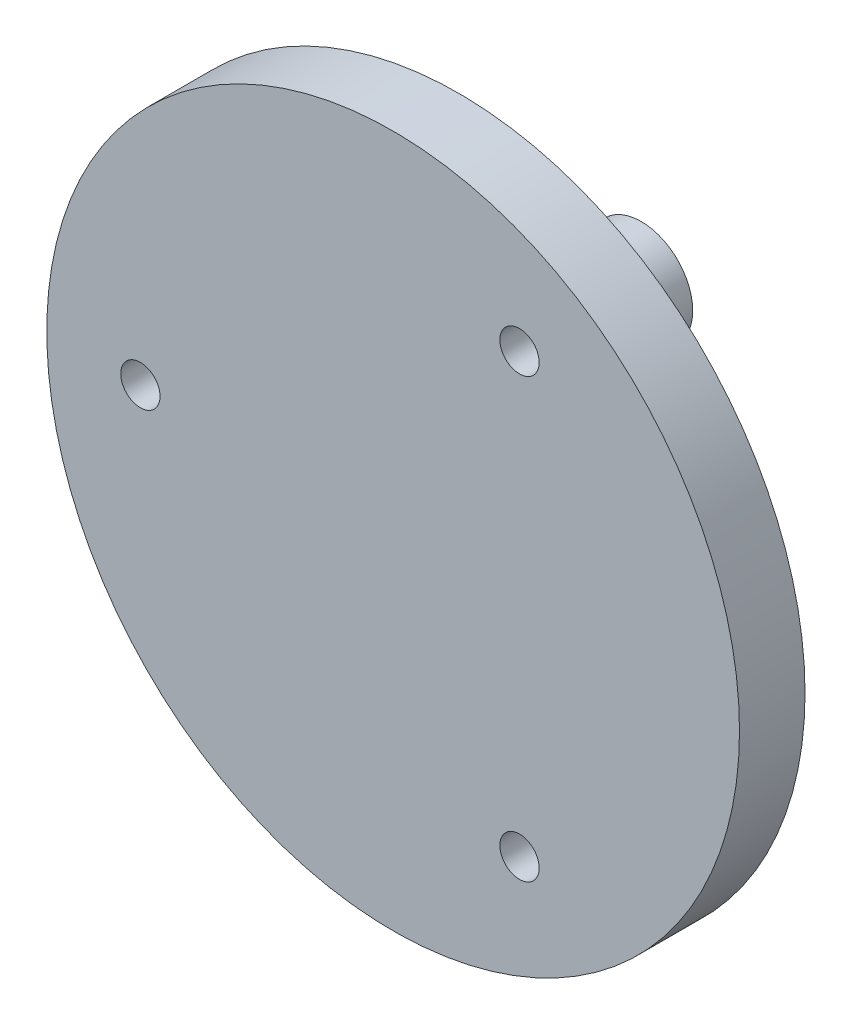
ISO-10303-21;
HEADER;
FILE_DESCRIPTION(('STEP AP214'),'2;1');
FILE_NAME('part.step','',(''),(''),'','','');
FILE_SCHEMA(('AUTOMOTIVE_DESIGN { 1 0 10303 214 1 1 1 1 }'));
ENDSEC;
DATA;
#1=APPLICATION_CONTEXT('core data for automotive mechanical design processes');
#2=APPLICATION_PROTOCOL_DEFINITION('international standard','automotive_design',2000,#1);
#3=PRODUCT_CONTEXT('',#1,'mechanical');
#4=PRODUCT('Part','Part','',(#3));
#5=PRODUCT_RELATED_PRODUCT_CATEGORY('part','',(#4));
#6=PRODUCT_DEFINITION_FORMATION('','',#4);
#7=PRODUCT_DEFINITION_CONTEXT('part definition',#1,'design');
#8=PRODUCT_DEFINITION('design','',#6,#7);
#9=PRODUCT_DEFINITION_SHAPE('','',#8);
#10=(LENGTH_UNIT() NAMED_UNIT(*) SI_UNIT(.MILLI.,.METRE.));
#11=(NAMED_UNIT(*) PLANE_ANGLE_UNIT() SI_UNIT($,.RADIAN.));
#12=(NAMED_UNIT(*) SI_UNIT($,.STERADIAN.) SOLID_ANGLE_UNIT());
#13=UNCERTAINTY_MEASURE_WITH_UNIT(LENGTH_MEASURE(1.E-05),#10,'distance_accuracy_value','');
#14=(GEOMETRIC_REPRESENTATION_CONTEXT(3) GLOBAL_UNCERTAINTY_ASSIGNED_CONTEXT((#13)) GLOBAL_UNIT_ASSIGNED_CONTEXT((#10,
#11,#12)) REPRESENTATION_CONTEXT('',''));
#15=CARTESIAN_POINT('',(0.,0.,0.));
#16=DIRECTION('',(0.,0.,1.));
#17=DIRECTION('',(1.,0.,0.));
#18=AXIS2_PLACEMENT_3D('',#15,#16,#17);
#19=CARTESIAN_POINT('',(0.,0.,10.123));
#20=DIRECTION('',(0.,0.,1.));
#21=DIRECTION('',(1.,0.,0.));
#22=AXIS2_PLACEMENT_3D('',#19,#20,#21);
#23=CYLINDRICAL_SURFACE('',#22,1.4);
#24=CARTESIAN_POINT('',(0.,0.,-1.5));
#25=DIRECTION('',(0.,0.,1.));
#26=DIRECTION('',(1.,0.,0.));
#27=AXIS2_PLACEMENT_3D('',#24,#25,#26);
#28=CIRCLE('',#27,1.4);
#29=CARTESIAN_POINT('',(1.4,0.,-1.5));
#30=VERTEX_POINT('',#29);
#31=EDGE_CURVE('E88',#30,#30,#28,.T.);
#32=ORIENTED_EDGE('',*,*,#31,.T.);
#33=EDGE_LOOP('',(#32));
#34=FACE_BOUND('',#33,.T.);
#35=CARTESIAN_POINT('',(0.,0.,-9.));
#36=DIRECTION('',(0.,0.,1.));
#37=DIRECTION('',(1.,0.,0.));
#38=AXIS2_PLACEMENT_3D('',#35,#36,#37);
#39=CIRCLE('',#38,1.4);
#40=CARTESIAN_POINT('',(1.4,0.,-9.));
#41=VERTEX_POINT('',#40);
#42=EDGE_CURVE('E10',#41,#41,#39,.T.);
#43=ORIENTED_EDGE('',*,*,#42,.F.);
#44=EDGE_LOOP('',(#43));
#45=FACE_BOUND('',#44,.T.);
#46=ADVANCED_FACE('F37',(#34,#45),#23,.F.);
#47=CARTESIAN_POINT('',(1.4,0.,-9.));
#48=DIRECTION('',(0.,0.,-1.));
#49=DIRECTION('',(-1.,0.,0.));
#50=AXIS2_PLACEMENT_3D('',#47,#48,#49);
#51=PLANE('',#50);
#52=ORIENTED_EDGE('',*,*,#42,.T.);
#53=EDGE_LOOP('',(#52));
#54=FACE_BOUND('',#53,.T.);
#55=CARTESIAN_POINT('',(0.,0.,-9.));
#56=DIRECTION('',(0.,0.,1.));
#57=DIRECTION('',(1.,0.,0.));
#58=AXIS2_PLACEMENT_3D('',#55,#56,#57);
#59=CIRCLE('',#58,3.45);
#60=CARTESIAN_POINT('',(3.45,0.,-9.));
#61=VERTEX_POINT('',#60);
#62=EDGE_CURVE('E44',#61,#61,#59,.T.);
#63=ORIENTED_EDGE('',*,*,#62,.F.);
#64=EDGE_LOOP('',(#63));
#65=FACE_BOUND('',#64,.T.);
#66=ADVANCED_FACE('F112',(#54,#65),#51,.T.);
#67=CARTESIAN_POINT('',(0.,0.,10.123));
#68=DIRECTION('',(0.,0.,1.));
#69=DIRECTION('',(1.,0.,0.));
#70=AXIS2_PLACEMENT_3D('',#67,#68,#69);
#71=CYLINDRICAL_SURFACE('',#70,3.45);
#72=ORIENTED_EDGE('',*,*,#62,.T.);
#73=EDGE_LOOP('',(#72));
#74=FACE_BOUND('',#73,.T.);
#75=CARTESIAN_POINT('',(0.,0.,-3.7));
#76=DIRECTION('',(0.,0.,1.));
#77=DIRECTION('',(1.,0.,0.));
#78=AXIS2_PLACEMENT_3D('',#75,#76,#77);
#79=CIRCLE('',#78,3.45);
#80=CARTESIAN_POINT('',(3.45,0.,-3.7));
#81=VERTEX_POINT('',#80);
#82=EDGE_CURVE('E49',#81,#81,#79,.T.);
#83=ORIENTED_EDGE('',*,*,#82,.F.);
#84=EDGE_LOOP('',(#83));
#85=FACE_BOUND('',#84,.T.);
#86=ADVANCED_FACE('F110',(#74,#85),#71,.T.);
#87=CARTESIAN_POINT('',(3.45,0.,-3.7));
#88=DIRECTION('',(0.,0.,-1.));
#89=DIRECTION('',(-1.,0.,0.));
#90=AXIS2_PLACEMENT_3D('',#87,#88,#89);
#91=PLANE('',#90);
#92=ORIENTED_EDGE('',*,*,#82,.T.);
#93=EDGE_LOOP('',(#92));
#94=FACE_BOUND('',#93,.T.);
#95=CARTESIAN_POINT('',(0.,0.,-3.7));
#96=DIRECTION('',(0.,0.,1.));
#97=DIRECTION('',(1.,0.,0.));
#98=AXIS2_PLACEMENT_3D('',#95,#96,#97);
#99=CIRCLE('',#98,4.5);
#100=CARTESIAN_POINT('',(4.5,0.,-3.7));
#101=VERTEX_POINT('',#100);
#102=EDGE_CURVE('E102',#101,#101,#99,.T.);
#103=ORIENTED_EDGE('',*,*,#102,.F.);
#104=EDGE_LOOP('',(#103));
#105=FACE_BOUND('',#104,.T.);
#106=ADVANCED_FACE('F107',(#94,#105),#91,.T.);
#107=CARTESIAN_POINT('',(0.,0.,10.123));
#108=DIRECTION('',(0.,0.,1.));
#109=DIRECTION('',(1.,0.,0.));
#110=AXIS2_PLACEMENT_3D('',#107,#108,#109);
#111=CYLINDRICAL_SURFACE('',#110,4.5);
#112=ORIENTED_EDGE('',*,*,#102,.T.);
#113=EDGE_LOOP('',(#112));
#114=FACE_BOUND('',#113,.T.);
#115=CARTESIAN_POINT('',(0.,0.,-3.5));
#116=DIRECTION('',(0.,0.,1.));
#117=DIRECTION('',(1.,0.,0.));
#118=AXIS2_PLACEMENT_3D('',#115,#116,#117);
#119=CIRCLE('',#118,4.5);
#120=CARTESIAN_POINT('',(4.5,0.,-3.5));
#121=VERTEX_POINT('',#120);
#122=EDGE_CURVE('E99',#121,#121,#119,.T.);
#123=ORIENTED_EDGE('',*,*,#122,.F.);
#124=EDGE_LOOP('',(#123));
#125=FACE_BOUND('',#124,.T.);
#126=ADVANCED_FACE('F119',(#114,#125),#111,.T.);
#127=CARTESIAN_POINT('',(4.5,0.,-3.5));
#128=DIRECTION('',(0.,0.,-1.));
#129=DIRECTION('',(-1.,0.,0.));
#130=AXIS2_PLACEMENT_3D('',#127,#128,#129);
#131=PLANE('',#130);
#132=CARTESIAN_POINT('',(6.74999999999985,11.69134295109,-3.5));
#133=DIRECTION('',(0.,0.,1.));
#134=DIRECTION('',(-0.499999999999992,-0.866025403784443,0.));
#135=AXIS2_PLACEMENT_3D('',#132,#133,#134);
#136=CIRCLE('',#135,2.75);
#137=CARTESIAN_POINT('',(5.37499999999987,9.30977309068279,-3.5));
#138=VERTEX_POINT('',#137);
#139=EDGE_CURVE('E73',#138,#138,#136,.T.);
#140=ORIENTED_EDGE('',*,*,#139,.T.);
#141=EDGE_LOOP('',(#140));
#142=FACE_BOUND('',#141,.T.);
#143=CARTESIAN_POINT('',(6.7500000000001,-11.6913429510899,-3.5));
#144=DIRECTION('',(0.,0.,1.));
#145=DIRECTION('',(-0.500000000000004,0.866025403784436,0.));
#146=AXIS2_PLACEMENT_3D('',#143,#144,#145);
#147=CIRCLE('',#146,2.75);
#148=CARTESIAN_POINT('',(5.37500000000009,-9.30977309068267,-3.5));
#149=VERTEX_POINT('',#148);
#150=EDGE_CURVE('E79',#149,#149,#147,.T.);
#151=ORIENTED_EDGE('',*,*,#150,.T.);
#152=EDGE_LOOP('',(#151));
#153=FACE_BOUND('',#152,.T.);
#154=CARTESIAN_POINT('',(-13.5,0.,-3.5));
#155=DIRECTION('',(0.,0.,1.));
#156=DIRECTION('',(1.,0.,0.));
#157=AXIS2_PLACEMENT_3D('',#154,#155,#156);
#158=CIRCLE('',#157,2.75);
#159=CARTESIAN_POINT('',(-10.75,0.,-3.5));
#160=VERTEX_POINT('',#159);
#161=EDGE_CURVE('E85',#160,#160,#158,.T.);
#162=ORIENTED_EDGE('',*,*,#161,.T.);
#163=EDGE_LOOP('',(#162));
#164=FACE_BOUND('',#163,.T.);
#165=ORIENTED_EDGE('',*,*,#122,.T.);
#166=EDGE_LOOP('',(#165));
#167=FACE_BOUND('',#166,.T.);
#168=CARTESIAN_POINT('',(0.,0.,-3.5));
#169=DIRECTION('',(0.,0.,1.));
#170=DIRECTION('',(1.,0.,0.));
#171=AXIS2_PLACEMENT_3D('',#168,#169,#170);
#172=CIRCLE('',#171,18.5);
#173=CARTESIAN_POINT('',(18.5,0.,-3.5));
#174=VERTEX_POINT('',#173);
#175=EDGE_CURVE('E96',#174,#174,#172,.T.);
#176=ORIENTED_EDGE('',*,*,#175,.F.);
#177=EDGE_LOOP('',(#176));
#178=FACE_BOUND('',#177,.T.);
#179=ADVANCED_FACE('F147',(#142,#153,#164,#167,#178),#131,.T.);
#180=CARTESIAN_POINT('',(0.,0.,10.123));
#181=DIRECTION('',(0.,0.,1.));
#182=DIRECTION('',(1.,0.,0.));
#183=AXIS2_PLACEMENT_3D('',#180,#181,#182);
#184=CYLINDRICAL_SURFACE('',#183,18.5);
#185=ORIENTED_EDGE('',*,*,#175,.T.);
#186=EDGE_LOOP('',(#185));
#187=FACE_BOUND('',#186,.T.);
#188=CARTESIAN_POINT('',(0.,0.,0.));
#189=DIRECTION('',(0.,0.,1.));
#190=DIRECTION('',(1.,0.,0.));
#191=AXIS2_PLACEMENT_3D('',#188,#189,#190);
#192=CIRCLE('',#191,18.5);
#193=CARTESIAN_POINT('',(18.5,0.,0.));
#194=VERTEX_POINT('',#193);
#195=EDGE_CURVE('E93',#194,#194,#192,.T.);
#196=ORIENTED_EDGE('',*,*,#195,.F.);
#197=EDGE_LOOP('',(#196));
#198=FACE_BOUND('',#197,.T.);
#199=ADVANCED_FACE('F140',(#187,#198),#184,.T.);
#200=CARTESIAN_POINT('',(18.5,0.,0.));
#201=DIRECTION('',(0.,0.,1.));
#202=DIRECTION('',(1.,0.,0.));
#203=AXIS2_PLACEMENT_3D('',#200,#201,#202);
#204=PLANE('',#203);
#205=CARTESIAN_POINT('',(6.7500000000001,-11.6913429510899,0.));
#206=DIRECTION('',(0.,0.,1.));
#207=DIRECTION('',(-0.500000000000004,0.866025403784436,0.));
#208=AXIS2_PLACEMENT_3D('',#205,#206,#207);
#209=CIRCLE('',#208,1.05);
#210=CARTESIAN_POINT('',(6.22500000000009,-10.7820162771162,0.));
#211=VERTEX_POINT('',#210);
#212=EDGE_CURVE('E59',#211,#211,#209,.T.);
#213=ORIENTED_EDGE('',*,*,#212,.F.);
#214=EDGE_LOOP('',(#213));
#215=FACE_BOUND('',#214,.T.);
#216=CARTESIAN_POINT('',(6.74999999999985,11.69134295109,0.));
#217=DIRECTION('',(0.,0.,1.));
#218=DIRECTION('',(-0.499999999999992,-0.866025403784443,0.));
#219=AXIS2_PLACEMENT_3D('',#216,#217,#218);
#220=CIRCLE('',#219,1.05);
#221=CARTESIAN_POINT('',(6.22499999999986,10.7820162771163,0.));
#222=VERTEX_POINT('',#221);
#223=EDGE_CURVE('E64',#222,#222,#220,.T.);
#224=ORIENTED_EDGE('',*,*,#223,.F.);
#225=EDGE_LOOP('',(#224));
#226=FACE_BOUND('',#225,.T.);
#227=CARTESIAN_POINT('',(-13.5,0.,0.));
#228=DIRECTION('',(0.,0.,1.));
#229=DIRECTION('',(1.,0.,0.));
#230=AXIS2_PLACEMENT_3D('',#227,#228,#229);
#231=CIRCLE('',#230,1.05);
#232=CARTESIAN_POINT('',(-12.45,0.,0.));
#233=VERTEX_POINT('',#232);
#234=EDGE_CURVE('E56',#233,#233,#231,.T.);
#235=ORIENTED_EDGE('',*,*,#234,.F.);
#236=EDGE_LOOP('',(#235));
#237=FACE_BOUND('',#236,.T.);
#238=ORIENTED_EDGE('',*,*,#195,.T.);
#239=EDGE_LOOP('',(#238));
#240=FACE_BOUND('',#239,.T.);
#241=ADVANCED_FACE('F131',(#215,#226,#237,#240),#204,.T.);
#242=CARTESIAN_POINT('',(0.,0.,-1.5));
#243=DIRECTION('',(0.,0.,-1.));
#244=DIRECTION('',(-1.,0.,0.));
#245=AXIS2_PLACEMENT_3D('',#242,#243,#244);
#246=PLANE('',#245);
#247=ORIENTED_EDGE('',*,*,#31,.F.);
#248=EDGE_LOOP('',(#247));
#249=FACE_BOUND('',#248,.T.);
#250=ADVANCED_FACE('F128',(#249),#246,.T.);
#251=CARTESIAN_POINT('',(-13.5,0.,-3.5));
#252=DIRECTION('',(0.,0.,-1.));
#253=DIRECTION('',(-1.,0.,0.));
#254=AXIS2_PLACEMENT_3D('',#251,#252,#253);
#255=CYLINDRICAL_SURFACE('',#254,2.75);
#256=ORIENTED_EDGE('',*,*,#161,.F.);
#257=EDGE_LOOP('',(#256));
#258=FACE_BOUND('',#257,.T.);
#259=CARTESIAN_POINT('',(-13.5,0.,-6.5));
#260=DIRECTION('',(0.,0.,1.));
#261=DIRECTION('',(1.,0.,0.));
#262=AXIS2_PLACEMENT_3D('',#259,#260,#261);
#263=CIRCLE('',#262,2.75);
#264=CARTESIAN_POINT('',(-10.75,0.,-6.5));
#265=VERTEX_POINT('',#264);
#266=EDGE_CURVE('E82',#265,#265,#263,.T.);
#267=ORIENTED_EDGE('',*,*,#266,.T.);
#268=EDGE_LOOP('',(#267));
#269=FACE_BOUND('',#268,.T.);
#270=ADVANCED_FACE('F130',(#258,#269),#255,.T.);
#271=CARTESIAN_POINT('',(-13.5,0.,-6.5));
#272=DIRECTION('',(0.,0.,1.));
#273=DIRECTION('',(1.,0.,0.));
#274=AXIS2_PLACEMENT_3D('',#271,#272,#273);
#275=PLANE('',#274);
#276=CARTESIAN_POINT('',(-13.5,0.,-6.5));
#277=DIRECTION('',(0.,0.,1.));
#278=DIRECTION('',(1.,0.,0.));
#279=AXIS2_PLACEMENT_3D('',#276,#277,#278);
#280=CIRCLE('',#279,1.05);
#281=CARTESIAN_POINT('',(-12.45,0.,-6.5));
#282=VERTEX_POINT('',#281);
#283=EDGE_CURVE('E53',#282,#282,#280,.T.);
#284=ORIENTED_EDGE('',*,*,#283,.T.);
#285=EDGE_LOOP('',(#284));
#286=FACE_BOUND('',#285,.T.);
#287=ORIENTED_EDGE('',*,*,#266,.F.);
#288=EDGE_LOOP('',(#287));
#289=FACE_BOUND('',#288,.T.);
#290=ADVANCED_FACE('F137',(#286,#289),#275,.F.);
#291=CARTESIAN_POINT('',(6.7500000000001,-11.6913429510899,-3.5));
#292=DIRECTION('',(0.,0.,-1.));
#293=DIRECTION('',(-1.,0.,0.));
#294=AXIS2_PLACEMENT_3D('',#291,#292,#293);
#295=CYLINDRICAL_SURFACE('',#294,2.75);
#296=ORIENTED_EDGE('',*,*,#150,.F.);
#297=EDGE_LOOP('',(#296));
#298=FACE_BOUND('',#297,.T.);
#299=CARTESIAN_POINT('',(6.7500000000001,-11.6913429510899,-6.5));
#300=DIRECTION('',(0.,0.,1.));
#301=DIRECTION('',(-0.500000000000004,0.866025403784436,0.));
#302=AXIS2_PLACEMENT_3D('',#299,#300,#301);
#303=CIRCLE('',#302,2.75);
#304=CARTESIAN_POINT('',(5.37500000000009,-9.30977309068267,-6.5));
#305=VERTEX_POINT('',#304);
#306=EDGE_CURVE('E76',#305,#305,#303,.T.);
#307=ORIENTED_EDGE('',*,*,#306,.T.);
#308=EDGE_LOOP('',(#307));
#309=FACE_BOUND('',#308,.T.);
#310=ADVANCED_FACE('F200',(#298,#309),#295,.T.);
#311=CARTESIAN_POINT('',(6.7500000000001,-11.6913429510899,-6.5));
#312=DIRECTION('',(0.,0.,1.));
#313=DIRECTION('',(-0.500000000000004,0.866025403784436,0.));
#314=AXIS2_PLACEMENT_3D('',#311,#312,#313);
#315=PLANE('',#314);
#316=CARTESIAN_POINT('',(6.7500000000001,-11.6913429510899,-6.5));
#317=DIRECTION('',(0.,0.,1.));
#318=DIRECTION('',(1.,0.,0.));
#319=AXIS2_PLACEMENT_3D('',#316,#317,#318);
#320=CIRCLE('',#319,1.05);
#321=CARTESIAN_POINT('',(7.8000000000001,-11.6913429510899,-6.5));
#322=VERTEX_POINT('',#321);
#323=EDGE_CURVE('E40',#322,#322,#320,.T.);
#324=ORIENTED_EDGE('',*,*,#323,.T.);
#325=EDGE_LOOP('',(#324));
#326=FACE_BOUND('',#325,.T.);
#327=ORIENTED_EDGE('',*,*,#306,.F.);
#328=EDGE_LOOP('',(#327));
#329=FACE_BOUND('',#328,.T.);
#330=ADVANCED_FACE('F194',(#326,#329),#315,.F.);
#331=CARTESIAN_POINT('',(6.74999999999985,11.69134295109,-3.5));
#332=DIRECTION('',(0.,0.,-1.));
#333=DIRECTION('',(-1.,0.,0.));
#334=AXIS2_PLACEMENT_3D('',#331,#332,#333);
#335=CYLINDRICAL_SURFACE('',#334,2.75);
#336=ORIENTED_EDGE('',*,*,#139,.F.);
#337=EDGE_LOOP('',(#336));
#338=FACE_BOUND('',#337,.T.);
#339=CARTESIAN_POINT('',(6.74999999999985,11.69134295109,-6.5));
#340=DIRECTION('',(0.,0.,1.));
#341=DIRECTION('',(-0.499999999999992,-0.866025403784443,0.));
#342=AXIS2_PLACEMENT_3D('',#339,#340,#341);
#343=CIRCLE('',#342,2.75);
#344=CARTESIAN_POINT('',(5.37499999999987,9.30977309068279,-6.5));
#345=VERTEX_POINT('',#344);
#346=EDGE_CURVE('E55',#345,#345,#343,.T.);
#347=ORIENTED_EDGE('',*,*,#346,.T.);
#348=EDGE_LOOP('',(#347));
#349=FACE_BOUND('',#348,.T.);
#350=ADVANCED_FACE('F199',(#338,#349),#335,.T.);
#351=CARTESIAN_POINT('',(6.74999999999985,11.69134295109,-6.5));
#352=DIRECTION('',(0.,0.,1.));
#353=DIRECTION('',(-0.499999999999992,-0.866025403784443,0.));
#354=AXIS2_PLACEMENT_3D('',#351,#352,#353);
#355=PLANE('',#354);
#356=CARTESIAN_POINT('',(6.74999999999985,11.69134295109,-6.5));
#357=DIRECTION('',(0.,0.,1.));
#358=DIRECTION('',(1.,0.,0.));
#359=AXIS2_PLACEMENT_3D('',#356,#357,#358);
#360=CIRCLE('',#359,1.05);
#361=CARTESIAN_POINT('',(7.79999999999985,11.69134295109,-6.5));
#362=VERTEX_POINT('',#361);
#363=EDGE_CURVE('E57',#362,#362,#360,.T.);
#364=ORIENTED_EDGE('',*,*,#363,.T.);
#365=EDGE_LOOP('',(#364));
#366=FACE_BOUND('',#365,.T.);
#367=ORIENTED_EDGE('',*,*,#346,.F.);
#368=EDGE_LOOP('',(#367));
#369=FACE_BOUND('',#368,.T.);
#370=ADVANCED_FACE('F211',(#366,#369),#355,.F.);
#371=CARTESIAN_POINT('',(-13.5,0.,-9.));
#372=DIRECTION('',(0.,0.,1.));
#373=DIRECTION('',(1.,0.,0.));
#374=AXIS2_PLACEMENT_3D('',#371,#372,#373);
#375=CYLINDRICAL_SURFACE('',#374,1.05);
#376=ORIENTED_EDGE('',*,*,#234,.T.);
#377=EDGE_LOOP('',(#376));
#378=FACE_BOUND('',#377,.T.);
#379=ORIENTED_EDGE('',*,*,#283,.F.);
#380=EDGE_LOOP('',(#379));
#381=FACE_BOUND('',#380,.T.);
#382=ADVANCED_FACE('F189',(#378,#381),#375,.F.);
#383=CARTESIAN_POINT('',(6.74999999999985,11.69134295109,-9.));
#384=DIRECTION('',(0.,0.,1.));
#385=DIRECTION('',(1.,0.,0.));
#386=AXIS2_PLACEMENT_3D('',#383,#384,#385);
#387=CYLINDRICAL_SURFACE('',#386,1.05);
#388=ORIENTED_EDGE('',*,*,#223,.T.);
#389=EDGE_LOOP('',(#388));
#390=FACE_BOUND('',#389,.T.);
#391=ORIENTED_EDGE('',*,*,#363,.F.);
#392=EDGE_LOOP('',(#391));
#393=FACE_BOUND('',#392,.T.);
#394=ADVANCED_FACE('F221',(#390,#393),#387,.F.);
#395=CARTESIAN_POINT('',(6.7500000000001,-11.6913429510899,-9.));
#396=DIRECTION('',(0.,0.,1.));
#397=DIRECTION('',(1.,0.,0.));
#398=AXIS2_PLACEMENT_3D('',#395,#396,#397);
#399=CYLINDRICAL_SURFACE('',#398,1.05);
#400=ORIENTED_EDGE('',*,*,#212,.T.);
#401=EDGE_LOOP('',(#400));
#402=FACE_BOUND('',#401,.T.);
#403=ORIENTED_EDGE('',*,*,#323,.F.);
#404=EDGE_LOOP('',(#403));
#405=FACE_BOUND('',#404,.T.);
#406=ADVANCED_FACE('F226',(#402,#405),#399,.F.);
#407=CLOSED_SHELL('',(#46,#66,#86,#106,#126,#179,#199,#241,#250,#270,#290,#310,#330,#350,#370,
#382,#394,#406));
#408=MANIFOLD_SOLID_BREP('B2',#407);
#409=ADVANCED_BREP_SHAPE_REPRESENTATION('',(#18,#408),#14);
#410=SHAPE_DEFINITION_REPRESENTATION(#9,#409);
ENDSEC;
END-ISO-10303-21;
